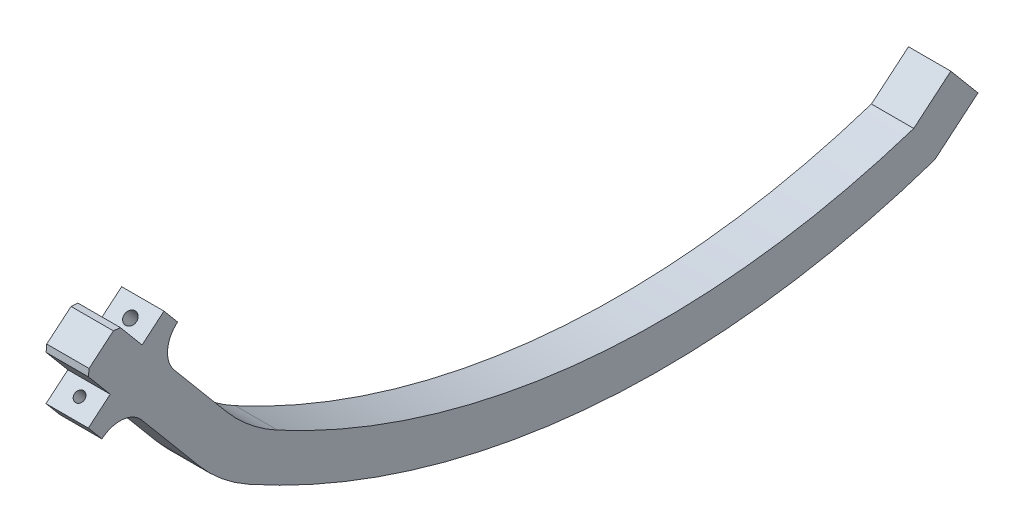
ISO-10303-21;
HEADER;
FILE_DESCRIPTION(('STEP AP214'),'2;1');
FILE_NAME('part.step','',(''),(''),'','','');
FILE_SCHEMA(('AUTOMOTIVE_DESIGN { 1 0 10303 214 1 1 1 1 }'));
ENDSEC;
DATA;
#1=APPLICATION_CONTEXT('core data for automotive mechanical design processes');
#2=APPLICATION_PROTOCOL_DEFINITION('international standard','automotive_design',2000,#1);
#3=PRODUCT_CONTEXT('',#1,'mechanical');
#4=PRODUCT('Part','Part','',(#3));
#5=PRODUCT_RELATED_PRODUCT_CATEGORY('part','',(#4));
#6=PRODUCT_DEFINITION_FORMATION('','',#4);
#7=PRODUCT_DEFINITION_CONTEXT('part definition',#1,'design');
#8=PRODUCT_DEFINITION('design','',#6,#7);
#9=PRODUCT_DEFINITION_SHAPE('','',#8);
#10=(LENGTH_UNIT() NAMED_UNIT(*) SI_UNIT(.MILLI.,.METRE.));
#11=(NAMED_UNIT(*) PLANE_ANGLE_UNIT() SI_UNIT($,.RADIAN.));
#12=(NAMED_UNIT(*) SI_UNIT($,.STERADIAN.) SOLID_ANGLE_UNIT());
#13=UNCERTAINTY_MEASURE_WITH_UNIT(LENGTH_MEASURE(1.E-05),#10,'distance_accuracy_value','');
#14=(GEOMETRIC_REPRESENTATION_CONTEXT(3) GLOBAL_UNCERTAINTY_ASSIGNED_CONTEXT((#13)) GLOBAL_UNIT_ASSIGNED_CONTEXT((#10,
#11,#12)) REPRESENTATION_CONTEXT('',''));
#15=CARTESIAN_POINT('',(0.,0.,0.));
#16=DIRECTION('',(0.,0.,1.));
#17=DIRECTION('',(1.,0.,0.));
#18=AXIS2_PLACEMENT_3D('',#15,#16,#17);
#19=CARTESIAN_POINT('',(12.,74.1271087713884,207.342601755654));
#20=DIRECTION('',(-1.,0.,0.));
#21=DIRECTION('',(0.,0.,1.));
#22=AXIS2_PLACEMENT_3D('',#19,#20,#21);
#23=CYLINDRICAL_SURFACE('',#22,8.00000000000002);
#24=CARTESIAN_POINT('',(0.,74.1271087713884,207.342601755654));
#25=DIRECTION('',(1.,0.,0.));
#26=DIRECTION('',(0.,0.,-1.));
#27=AXIS2_PLACEMENT_3D('',#24,#25,#26);
#28=CIRCLE('',#27,8.00000000000002);
#29=CARTESIAN_POINT('',(0.,80.2554643163402,212.484902633146));
#30=VERTEX_POINT('',#29);
#31=CARTESIAN_POINT('',(0.,68.9848078938961,213.470957300606));
#32=VERTEX_POINT('',#31);
#33=EDGE_CURVE('E194',#30,#32,#28,.T.);
#34=ORIENTED_EDGE('',*,*,#33,.F.);
#35=DIRECTION('',(-1.,0.,0.));
#36=VECTOR('',#35,1.);
#37=CARTESIAN_POINT('',(12.,80.2554643163402,212.484902633146));
#38=LINE('',#37,#36);
#39=CARTESIAN_POINT('',(12.,80.2554643163402,212.484902633146));
#40=VERTEX_POINT('',#39);
#41=EDGE_CURVE('E245',#40,#30,#38,.T.);
#42=ORIENTED_EDGE('',*,*,#41,.F.);
#43=CARTESIAN_POINT('',(12.,74.1271087713884,207.342601755654));
#44=DIRECTION('',(1.,0.,0.));
#45=DIRECTION('',(0.,0.,-1.));
#46=AXIS2_PLACEMENT_3D('',#43,#44,#45);
#47=CIRCLE('',#46,8.00000000000002);
#48=CARTESIAN_POINT('',(12.,68.9848078938961,213.470957300606));
#49=VERTEX_POINT('',#48);
#50=EDGE_CURVE('E233',#40,#49,#47,.T.);
#51=ORIENTED_EDGE('',*,*,#50,.T.);
#52=DIRECTION('',(-1.,0.,0.));
#53=VECTOR('',#52,1.);
#54=CARTESIAN_POINT('',(12.,68.9848078938961,213.470957300606));
#55=LINE('',#54,#53);
#56=EDGE_CURVE('E241',#49,#32,#55,.T.);
#57=ORIENTED_EDGE('',*,*,#56,.T.);
#58=EDGE_LOOP('',(#34,#42,#51,#57));
#59=FACE_BOUND('',#58,.T.);
#60=CARTESIAN_POINT('',(7.46354696492271,72.7379233500529,215.221063779751));
#61=CARTESIAN_POINT('',(7.50958148855328,72.7949489550504,215.231122511564));
#62=CARTESIAN_POINT('',(7.55431123800115,72.8530918477319,215.240732876881));
#63=CARTESIAN_POINT('',(7.64129948290581,72.9713409745247,215.258899053747));
#64=CARTESIAN_POINT('',(7.68355847351806,73.0314468114605,215.267455076977));
#65=CARTESIAN_POINT('',(7.76575888459811,73.1533692767686,215.283358338121));
#66=CARTESIAN_POINT('',(7.80570047439717,73.2151857796548,215.290705664427));
#67=CARTESIAN_POINT('',(7.88334496343659,73.3403491122129,215.304069722106));
#68=CARTESIAN_POINT('',(7.92104771447449,73.4036960428036,215.310086365465));
#69=CARTESIAN_POINT('',(8.03186693351505,73.5975475732911,215.326116981634));
#70=CARTESIAN_POINT('',(8.10158724359517,73.7302094640097,215.333890311335));
#71=CARTESIAN_POINT('',(8.23190456869935,74.0001583942434,215.342735322807));
#72=CARTESIAN_POINT('',(8.29250077741559,74.1374458412141,215.343806412631));
#73=CARTESIAN_POINT('',(8.40432850268299,74.416677847091,215.338586133065));
#74=CARTESIAN_POINT('',(8.45549875368406,74.5586462572177,215.332248437505));
#75=CARTESIAN_POINT('',(8.54699183390785,74.8455140384599,215.311577560258));
#76=CARTESIAN_POINT('',(8.58731348534083,74.9904137259782,215.297243510958));
#77=CARTESIAN_POINT('',(8.65553377664549,75.2812566816938,215.260259289782));
#78=CARTESIAN_POINT('',(8.6834996882634,75.4271897906444,215.237655406847));
#79=CARTESIAN_POINT('',(8.72564020470527,75.7194065540804,215.18394365346));
#80=CARTESIAN_POINT('',(8.73982493835189,75.8656898717773,215.152842050196));
#81=CARTESIAN_POINT('',(8.75395513480862,76.1892416522893,215.074422104802));
#82=CARTESIAN_POINT('',(8.75005949771982,76.3662108693341,215.0250387254));
#83=CARTESIAN_POINT('',(8.71530205925443,76.7140968241649,214.914962521356));
#84=CARTESIAN_POINT('',(8.68445023066477,76.8850157759933,214.85427388577));
#85=CARTESIAN_POINT('',(8.61571414363197,77.133403204539,214.756797137446));
#86=CARTESIAN_POINT('',(8.58887638446079,77.2152381964416,214.723054254985));
#87=CARTESIAN_POINT('',(8.52744279758176,77.3752519539021,214.654039858714));
#88=CARTESIAN_POINT('',(8.49285097255972,77.4534325807865,214.618769141131));
#89=CARTESIAN_POINT('',(8.41586189069508,77.6053448540179,214.547386157525));
#90=CARTESIAN_POINT('',(8.37347181495184,77.6790805112913,214.511274692219));
#91=CARTESIAN_POINT('',(8.28098484056662,77.8214466964627,214.438955851652));
#92=CARTESIAN_POINT('',(8.23089160226708,77.8900796261854,214.402748529928));
#93=CARTESIAN_POINT('',(8.11823909114113,78.0277311007013,214.327717025179));
#94=CARTESIAN_POINT('',(8.05495478322723,78.0961959995371,214.288961269613));
#95=CARTESIAN_POINT('',(7.92010890238927,78.2255938774786,214.213415491001));
#96=CARTESIAN_POINT('',(7.84854987454188,78.2865291606223,214.176624868597));
#97=CARTESIAN_POINT('',(7.77315894214442,78.3433636047374,214.141365994856));
#98=B_SPLINE_CURVE_WITH_KNOTS('',3,(#60,#61,#62,#63,#64,#65,#66,#67,#68,#69,#70,#71,#72,#73,#74,
#75,#76,#77,#78,#79,#80,#81,#82,#83,#84,#85,#86,#87,#88,#89,#90,#91,#92,#93,#94,#95,#96,#97),
.UNSPECIFIED.,.F.,.F.,(4,2,2,2,2,2,2,2,2,2,2,2,2,2,2,2,2,2,4),(0.,0.221885951803031,
0.443727282774338,0.665552383449442,0.887392151756312,1.33706062495993,1.78676881261483,
2.23930407505452,2.69188844765875,3.14197737552839,3.59173524842635,4.14092084812213,
4.68990335558945,4.96705220630397,5.24405831957735,5.52081061430763,5.79743180760208,
6.09968703637855,6.40184954578756),.UNSPECIFIED.);
#99=CARTESIAN_POINT('',(7.4635469649228,72.737923350053,215.221063779751));
#100=VERTEX_POINT('',#99);
#101=CARTESIAN_POINT('',(7.77315894214437,78.3433636047375,214.141365994856));
#102=VERTEX_POINT('',#101);
#103=EDGE_CURVE('E346',#100,#102,#98,.T.);
#104=ORIENTED_EDGE('',*,*,#103,.T.);
#105=DIRECTION('',(-1.,0.,0.));
#106=VECTOR('',#105,1.);
#107=CARTESIAN_POINT('',(12.,78.3433636047375,214.141365994856));
#108=LINE('',#107,#106);
#109=CARTESIAN_POINT('',(4.22684105785563,78.3433636047375,214.141365994856));
#110=VERTEX_POINT('',#109);
#111=EDGE_CURVE('E227',#102,#110,#108,.T.);
#112=ORIENTED_EDGE('',*,*,#111,.T.);
#113=CARTESIAN_POINT('',(4.22684105785559,78.3433636047374,214.141365994856));
#114=CARTESIAN_POINT('',(4.16867459148364,78.2994879589187,214.168578729294));
#115=CARTESIAN_POINT('',(4.11277396126892,78.2531878615175,214.19670059365));
#116=CARTESIAN_POINT('',(4.00583648196659,78.1560442762788,214.254247975018));
#117=CARTESIAN_POINT('',(3.95479807504497,78.1052022538384,214.283673070024));
#118=CARTESIAN_POINT('',(3.85810117687148,77.9994942486752,214.343193907461));
#119=CARTESIAN_POINT('',(3.81241912786715,77.9446477515177,214.373285963324));
#120=CARTESIAN_POINT('',(3.72638156448441,77.8311007418773,214.433764883307));
#121=CARTESIAN_POINT('',(3.68602622477214,77.772400103109,214.464151757058));
#122=CARTESIAN_POINT('',(3.57323579405075,77.5911648430695,214.554984645678));
#123=CARTESIAN_POINT('',(3.50892543331302,77.4633308446304,214.615198160394));
#124=CARTESIAN_POINT('',(3.40221110982432,77.1971460619567,214.731514176474));
#125=CARTESIAN_POINT('',(3.35982377382767,77.0587873865997,214.787613530005));
#126=CARTESIAN_POINT('',(3.29386248450905,76.7663235903946,214.896430928469));
#127=CARTESIAN_POINT('',(3.27159506113856,76.6117728255835,214.948733460313));
#128=CARTESIAN_POINT('',(3.24821838550937,76.2983159743403,215.044078057078));
#129=CARTESIAN_POINT('',(3.24711820350719,76.1394080500521,215.087116144334));
#130=CARTESIAN_POINT('',(3.26132058748157,75.8628017254614,215.152972030641));
#131=CARTESIAN_POINT('',(3.27233296511735,75.7453987243075,215.178122390013));
#132=CARTESIAN_POINT('',(3.30338124234523,75.5107289852771,215.222950023977));
#133=CARTESIAN_POINT('',(3.32342051999276,75.3934623149041,215.242625245195));
#134=CARTESIAN_POINT('',(3.39584933525798,75.0424038287906,215.29358171257));
#135=CARTESIAN_POINT('',(3.46051851778779,74.8098290091888,215.316682103549));
#136=CARTESIAN_POINT('',(3.58774016643512,74.4378124300205,215.337870783037));
#137=CARTESIAN_POINT('',(3.64221601881,74.295762307957,215.342052245629));
#138=CARTESIAN_POINT('',(3.76099269325124,74.0156748965883,215.343048948672));
#139=CARTESIAN_POINT('',(3.82529842572279,73.8776396541194,215.339860496262));
#140=CARTESIAN_POINT('',(3.96302843241761,73.6069943775078,215.326824211775));
#141=CARTESIAN_POINT('',(4.03642935682221,73.4743715670909,215.31699315523));
#142=CARTESIAN_POINT('',(4.19248248537371,73.2153586213183,215.29153850667));
#143=CARTESIAN_POINT('',(4.27512671647115,73.0889632478611,215.275919880374));
#144=CARTESIAN_POINT('',(4.39068100152986,72.927564075143,215.252257430339));
#145=CARTESIAN_POINT('',(4.41909584967436,72.8889874376872,215.246306543818));
#146=CARTESIAN_POINT('',(4.47697047247836,72.8127556252071,215.233987155079));
#147=CARTESIAN_POINT('',(4.50642919044074,72.775099580066,215.227619069938));
#148=CARTESIAN_POINT('',(4.53645303507725,72.7379233500529,215.221063779751));
#149=B_SPLINE_CURVE_WITH_KNOTS('',3,(#113,#114,#115,#116,#117,#118,#119,#120,#121,#122,#123,
#124,#125,#126,#127,#128,#129,#130,#131,#132,#133,#134,#135,#136,#137,#138,#139,#140,#141,#142,
#143,#144,#145,#146,#147,#148),.UNSPECIFIED.,.F.,.F.,(4,2,2,2,2,2,2,2,2,2,2,2,2,2,2,2,2,4),(0.,
0.23323628560383,0.466397590263524,0.698491569527056,0.930593157408039,1.39407446711088,
1.85790677451497,2.3500558701375,2.84241584912891,3.2036554871883,3.56503042115028,
4.28923053457336,4.74537232050212,5.20174271604674,5.65696485970891,6.1117973249391,
6.25662116386555,6.40130236765936),.UNSPECIFIED.);
#150=CARTESIAN_POINT('',(4.5364530350772,72.737923350053,215.221063779751));
#151=VERTEX_POINT('',#150);
#152=EDGE_CURVE('E355',#110,#151,#149,.T.);
#153=ORIENTED_EDGE('',*,*,#152,.T.);
#154=DIRECTION('',(-1.,0.,0.));
#155=VECTOR('',#154,1.);
#156=CARTESIAN_POINT('',(12.,72.737923350053,215.221063779751));
#157=LINE('',#156,#155);
#158=EDGE_CURVE('E342',#100,#151,#157,.T.);
#159=ORIENTED_EDGE('',*,*,#158,.F.);
#160=EDGE_LOOP('',(#104,#112,#153,#159));
#161=FACE_BOUND('',#160,.T.);
#162=ADVANCED_FACE('F34',(#59,#161),#23,.F.);
#163=CARTESIAN_POINT('',(6.,74.2344635393063,213.437556632747));
#164=DIRECTION('',(0.,0.766044443118983,0.642787609686534));
#165=DIRECTION('',(0.,-0.642787609686534,0.766044443118983));
#166=AXIS2_PLACEMENT_3D('',#163,#164,#165);
#167=CYLINDRICAL_SURFACE('',#166,1.74999999999999);
#168=CARTESIAN_POINT('',(6.,81.8949079704961,219.865432729613));
#169=DIRECTION('',(0.,0.766044443118983,0.642787609686534));
#170=DIRECTION('',(0.,-0.642787609686534,0.766044443118983));
#171=AXIS2_PLACEMENT_3D('',#168,#169,#170);
#172=CIRCLE('',#171,1.74999999999999);
#173=CARTESIAN_POINT('',(6.,80.7700296535447,221.206010505071));
#174=VERTEX_POINT('',#173);
#175=EDGE_CURVE('E230',#174,#174,#172,.T.);
#176=ORIENTED_EDGE('',*,*,#175,.T.);
#177=EDGE_LOOP('',(#176));
#178=FACE_BOUND('',#177,.T.);
#179=CARTESIAN_POINT('',(6.,76.9922235345346,215.751592027619));
#180=DIRECTION('',(0.,-0.766044443118983,-0.642787609686534));
#181=DIRECTION('',(0.,0.642787609686534,-0.766044443118983));
#182=AXIS2_PLACEMENT_3D('',#179,#180,#181);
#183=CIRCLE('',#182,1.74999999999999);
#184=CARTESIAN_POINT('',(6.,78.117101851486,214.41101425216));
#185=VERTEX_POINT('',#184);
#186=EDGE_CURVE('E225',#185,#185,#183,.F.);
#187=ORIENTED_EDGE('',*,*,#186,.F.);
#188=EDGE_LOOP('',(#187));
#189=FACE_BOUND('',#188,.T.);
#190=ADVANCED_FACE('F373',(#178,#189),#167,.F.);
#191=CARTESIAN_POINT('',(-52.3125128274926,79.7094300975618,222.469983836217));
#192=DIRECTION('',(0.,0.642787609686534,-0.766044443118982));
#193=DIRECTION('',(0.,0.766044443118982,0.642787609686534));
#194=AXIS2_PLACEMENT_3D('',#191,#192,#193);
#195=PLANE('',#194);
#196=DIRECTION('',(0.,0.766044443118982,0.642787609686534));
#197=VECTOR('',#196,1.);
#198=CARTESIAN_POINT('',(0.,79.7094300975618,222.469983836217));
#199=LINE('',#198,#197);
#200=CARTESIAN_POINT('',(0.,51.3867992041198,198.70447469956));
#201=VERTEX_POINT('',#200);
#202=EDGE_CURVE('E284',#201,#32,#199,.T.);
#203=ORIENTED_EDGE('',*,*,#202,.T.);
#204=ORIENTED_EDGE('',*,*,#56,.F.);
#205=DIRECTION('',(0.,0.766044443118982,0.642787609686534));
#206=VECTOR('',#205,1.);
#207=CARTESIAN_POINT('',(12.,79.7094300975618,222.469983836217));
#208=LINE('',#207,#206);
#209=CARTESIAN_POINT('',(12.,51.3867992041199,198.70447469956));
#210=VERTEX_POINT('',#209);
#211=EDGE_CURVE('E281',#210,#49,#208,.T.);
#212=ORIENTED_EDGE('',*,*,#211,.F.);
#213=DIRECTION('',(-1.,0.,0.));
#214=VECTOR('',#213,1.);
#215=CARTESIAN_POINT('',(-52.3125128274926,51.3867992041198,198.70447469956));
#216=LINE('',#215,#214);
#217=EDGE_CURVE('E336',#210,#201,#216,.T.);
#218=ORIENTED_EDGE('',*,*,#217,.T.);
#219=EDGE_LOOP('',(#203,#204,#212,#218));
#220=FACE_BOUND('',#219,.T.);
#221=ADVANCED_FACE('F377',(#220),#195,.T.);
#222=CARTESIAN_POINT('',(0.,71.9959787813234,231.662517153645));
#223=DIRECTION('',(0.,0.642787609686535,-0.766044443118982));
#224=DIRECTION('',(0.,0.766044443118982,0.642787609686535));
#225=AXIS2_PLACEMENT_3D('',#222,#223,#224);
#226=PLANE('',#225);
#227=DIRECTION('',(-1.,0.,0.));
#228=VECTOR('',#227,1.);
#229=CARTESIAN_POINT('',(12.,61.2713565776577,222.663490618033));
#230=LINE('',#229,#228);
#231=CARTESIAN_POINT('',(12.,61.2713565776577,222.663490618033));
#232=VERTEX_POINT('',#231);
#233=CARTESIAN_POINT('',(0.,61.2713565776577,222.663490618033));
#234=VERTEX_POINT('',#233);
#235=EDGE_CURVE('E260',#232,#234,#230,.T.);
#236=ORIENTED_EDGE('',*,*,#235,.T.);
#237=DIRECTION('',(0.,-0.766044443118982,-0.642787609686535));
#238=VECTOR('',#237,1.);
#239=CARTESIAN_POINT('',(0.,94.3966616452473,250.458921882882));
#240=LINE('',#239,#238);
#241=CARTESIAN_POINT('',(0.,41.9450844088605,206.446822769164));
#242=VERTEX_POINT('',#241);
#243=EDGE_CURVE('E321',#234,#242,#240,.T.);
#244=ORIENTED_EDGE('',*,*,#243,.T.);
#245=DIRECTION('',(-1.,0.,0.));
#246=VECTOR('',#245,1.);
#247=CARTESIAN_POINT('',(0.,41.9450844088605,206.446822769164));
#248=LINE('',#247,#246);
#249=CARTESIAN_POINT('',(12.,41.9450844088605,206.446822769164));
#250=VERTEX_POINT('',#249);
#251=EDGE_CURVE('E329',#242,#250,#248,.F.);
#252=ORIENTED_EDGE('',*,*,#251,.T.);
#253=DIRECTION('',(0.,0.766044443118982,0.642787609686535));
#254=VECTOR('',#253,1.);
#255=CARTESIAN_POINT('',(12.,71.9959787813234,231.662517153645));
#256=LINE('',#255,#254);
#257=EDGE_CURVE('E279',#250,#232,#256,.T.);
#258=ORIENTED_EDGE('',*,*,#257,.T.);
#259=EDGE_LOOP('',(#236,#244,#252,#258));
#260=FACE_BOUND('',#259,.T.);
#261=ADVANCED_FACE('F436',(#260),#226,.F.);
#262=CARTESIAN_POINT('',(12.,241.476472406345,75.1760290102655));
#263=DIRECTION('',(-1.,0.,0.));
#264=DIRECTION('',(0.,0.,1.));
#265=AXIS2_PLACEMENT_3D('',#262,#263,#264);
#266=CYLINDRICAL_SURFACE('',#265,241.476472406345);
#267=CARTESIAN_POINT('',(12.,241.476472406345,75.1760290102655));
#268=DIRECTION('',(1.,0.,0.));
#269=DIRECTION('',(0.,0.,1.));
#270=AXIS2_PLACEMENT_3D('',#267,#268,#269);
#271=CIRCLE('',#270,241.476472406345);
#272=CARTESIAN_POINT('',(12.,30.3736096091177,192.421361730282));
#273=VERTEX_POINT('',#272);
#274=CARTESIAN_POINT('',(12.,12.7411493725965,-2.22577150147341));
#275=VERTEX_POINT('',#274);
#276=EDGE_CURVE('E310',#273,#275,#271,.T.);
#277=ORIENTED_EDGE('',*,*,#276,.F.);
#278=DIRECTION('',(-1.,0.,0.));
#279=VECTOR('',#278,1.);
#280=CARTESIAN_POINT('',(12.,30.3736096091177,192.421361730282));
#281=LINE('',#280,#279);
#282=CARTESIAN_POINT('',(0.,30.3736096091177,192.421361730282));
#283=VERTEX_POINT('',#282);
#284=EDGE_CURVE('E323',#273,#283,#281,.T.);
#285=ORIENTED_EDGE('',*,*,#284,.T.);
#286=CARTESIAN_POINT('',(0.,241.476472406345,75.1760290102655));
#287=DIRECTION('',(1.,0.,0.));
#288=DIRECTION('',(0.,0.,1.));
#289=AXIS2_PLACEMENT_3D('',#286,#287,#288);
#290=CIRCLE('',#289,241.476472406345);
#291=CARTESIAN_POINT('',(0.,12.7411493725965,-2.22577150147341));
#292=VERTEX_POINT('',#291);
#293=EDGE_CURVE('E309',#283,#292,#290,.T.);
#294=ORIENTED_EDGE('',*,*,#293,.T.);
#295=DIRECTION('',(-1.,0.,0.));
#296=VECTOR('',#295,1.);
#297=CARTESIAN_POINT('',(12.,12.7411493725965,-2.22577150147341));
#298=LINE('',#297,#296);
#299=EDGE_CURVE('E306',#275,#292,#298,.T.);
#300=ORIENTED_EDGE('',*,*,#299,.F.);
#301=EDGE_LOOP('',(#277,#285,#294,#300));
#302=FACE_BOUND('',#301,.T.);
#303=ADVANCED_FACE('F445',(#302),#266,.T.);
#304=CARTESIAN_POINT('',(12.,241.476472406345,75.1760290102655));
#305=DIRECTION('',(-1.,0.,0.));
#306=DIRECTION('',(0.,0.,1.));
#307=AXIS2_PLACEMENT_3D('',#304,#305,#306);
#308=CYLINDRICAL_SURFACE('',#307,229.476472406345);
#309=CARTESIAN_POINT('',(0.,241.476472406345,75.1760290102655));
#310=DIRECTION('',(-1.,0.,0.));
#311=DIRECTION('',(0.,0.,1.));
#312=AXIS2_PLACEMENT_3D('',#309,#310,#311);
#313=CIRCLE('',#312,229.476472406345);
#314=CARTESIAN_POINT('',(0.,23.403668611832,3.73581881138778));
#315=VERTEX_POINT('',#314);
#316=CARTESIAN_POINT('',(0.,39.5231160556017,184.145259744128));
#317=VERTEX_POINT('',#316);
#318=EDGE_CURVE('E313',#315,#317,#313,.T.);
#319=ORIENTED_EDGE('',*,*,#318,.T.);
#320=DIRECTION('',(-1.,0.,0.));
#321=VECTOR('',#320,1.);
#322=CARTESIAN_POINT('',(12.,39.5231160556017,184.145259744128));
#323=LINE('',#322,#321);
#324=CARTESIAN_POINT('',(12.,39.5231160556017,184.145259744128));
#325=VERTEX_POINT('',#324);
#326=EDGE_CURVE('E333',#317,#325,#323,.F.);
#327=ORIENTED_EDGE('',*,*,#326,.T.);
#328=CARTESIAN_POINT('',(12.,241.476472406345,75.1760290102655));
#329=DIRECTION('',(-1.,0.,0.));
#330=DIRECTION('',(0.,0.,1.));
#331=AXIS2_PLACEMENT_3D('',#328,#329,#330);
#332=CIRCLE('',#331,229.476472406345);
#333=CARTESIAN_POINT('',(12.,23.403668611832,3.73581881138778));
#334=VERTEX_POINT('',#333);
#335=EDGE_CURVE('E312',#334,#325,#332,.T.);
#336=ORIENTED_EDGE('',*,*,#335,.F.);
#337=DIRECTION('',(-1.,0.,0.));
#338=VECTOR('',#337,1.);
#339=CARTESIAN_POINT('',(12.,23.403668611832,3.73581881138778));
#340=LINE('',#339,#338);
#341=EDGE_CURVE('E316',#334,#315,#340,.T.);
#342=ORIENTED_EDGE('',*,*,#341,.T.);
#343=EDGE_LOOP('',(#319,#327,#336,#342));
#344=FACE_BOUND('',#343,.T.);
#345=ADVANCED_FACE('F464',(#344),#308,.F.);
#346=CARTESIAN_POINT('',(12.,241.476472406345,75.1760290102655));
#347=DIRECTION('',(-1.,0.,0.));
#348=DIRECTION('',(0.,0.,1.));
#349=AXIS2_PLACEMENT_3D('',#346,#347,#348);
#350=PLANE('',#349);
#351=DIRECTION('',(0.,0.642787609686534,-0.766044443118982));
#352=VECTOR('',#351,1.);
#353=CARTESIAN_POINT('',(12.,79.7094300975618,222.469983836217));
#354=LINE('',#353,#352);
#355=CARTESIAN_POINT('',(12.,79.6451513365932,222.546588280529));
#356=VERTEX_POINT('',#355);
#357=CARTESIAN_POINT('',(12.,84.8517309750541,216.341628291265));
#358=VERTEX_POINT('',#357);
#359=EDGE_CURVE('E236',#356,#358,#354,.T.);
#360=ORIENTED_EDGE('',*,*,#359,.F.);
#361=DIRECTION('',(0.,-0.766044443118979,-0.642787609686538));
#362=VECTOR('',#361,1.);
#363=CARTESIAN_POINT('',(12.,79.6451513365932,222.546588280529));
#364=LINE('',#363,#362);
#365=CARTESIAN_POINT('',(12.,86.9991779905354,228.71734933352));
#366=VERTEX_POINT('',#365);
#367=EDGE_CURVE('E198',#366,#356,#364,.T.);
#368=ORIENTED_EDGE('',*,*,#367,.F.);
#369=DIRECTION('',(0.,0.0871557427476679,0.996194698091745));
#370=VECTOR('',#369,1.);
#371=CARTESIAN_POINT('',(12.,87.1717375573408,230.689714207447));
#372=LINE('',#371,#370);
#373=CARTESIAN_POINT('',(12.,87.1717375573408,230.689714207447));
#374=VERTEX_POINT('',#373);
#375=EDGE_CURVE('E11',#366,#374,#372,.T.);
#376=ORIENTED_EDGE('',*,*,#375,.T.);
#377=DIRECTION('',(0.,0.642787609686532,-0.766044443118984));
#378=VECTOR('',#377,1.);
#379=CARTESIAN_POINT('',(12.,80.4224676556322,238.733180860197));
#380=LINE('',#379,#378);
#381=CARTESIAN_POINT('',(12.,81.3866490701621,237.584114195518));
#382=VERTEX_POINT('',#381);
#383=EDGE_CURVE('E269',#382,#374,#380,.T.);
#384=ORIENTED_EDGE('',*,*,#383,.F.);
#385=DIRECTION('',(0.,0.996194698091746,-0.0871557427476487));
#386=VECTOR('',#385,1.);
#387=CARTESIAN_POINT('',(12.,81.3866490701621,237.584114195518));
#388=LINE('',#387,#386);
#389=CARTESIAN_POINT('',(12.,79.4142841962344,237.756673762324));
#390=VERTEX_POINT('',#389);
#391=EDGE_CURVE('E42',#382,#390,#388,.F.);
#392=ORIENTED_EDGE('',*,*,#391,.T.);
#393=DIRECTION('',(0.,0.766044443118984,0.642787609686532));
#394=VECTOR('',#393,1.);
#395=CARTESIAN_POINT('',(12.,72.0602575422921,231.585912709333));
#396=LINE('',#395,#394);
#397=CARTESIAN_POINT('',(12.,72.0602575422921,231.585912709333));
#398=VERTEX_POINT('',#397);
#399=EDGE_CURVE('E57',#398,#390,#396,.T.);
#400=ORIENTED_EDGE('',*,*,#399,.F.);
#401=DIRECTION('',(0.,0.642787609686534,-0.766044443118982));
#402=VECTOR('',#401,1.);
#403=CARTESIAN_POINT('',(12.,71.9959787813234,231.662517153645));
#404=LINE('',#403,#402);
#405=CARTESIAN_POINT('',(12.,66.8536779038312,237.790872698597));
#406=VERTEX_POINT('',#405);
#407=EDGE_CURVE('E258',#406,#398,#404,.T.);
#408=ORIENTED_EDGE('',*,*,#407,.F.);
#409=DIRECTION('',(0.,0.766044443118984,0.642787609686532));
#410=VECTOR('',#409,1.);
#411=CARTESIAN_POINT('',(12.,66.8536779038312,237.790872698597));
#412=LINE('',#411,#410);
#413=CARTESIAN_POINT('',(12.,62.2574112451172,233.934147040477));
#414=VERTEX_POINT('',#413);
#415=EDGE_CURVE('E254',#414,#406,#412,.T.);
#416=ORIENTED_EDGE('',*,*,#415,.F.);
#417=CARTESIAN_POINT('',(12.,56.1290557001654,228.791846162985));
#418=DIRECTION('',(1.,0.,0.));
#419=DIRECTION('',(0.,0.,1.));
#420=AXIS2_PLACEMENT_3D('',#417,#418,#419);
#421=CIRCLE('',#420,8.);
#422=EDGE_CURVE('E251',#232,#414,#421,.T.);
#423=ORIENTED_EDGE('',*,*,#422,.F.);
#424=ORIENTED_EDGE('',*,*,#257,.F.);
#425=CARTESIAN_POINT('',(12.,74.0844648931873,168.144600613215));
#426=DIRECTION('',(-1.,0.,0.));
#427=DIRECTION('',(0.,0.,1.));
#428=AXIS2_PLACEMENT_3D('',#425,#426,#427);
#429=CIRCLE('',#428,50.);
#430=EDGE_CURVE('E331',#250,#273,#429,.F.);
#431=ORIENTED_EDGE('',*,*,#430,.T.);
#432=ORIENTED_EDGE('',*,*,#276,.T.);
#433=DIRECTION('',(0.,0.642787609686534,-0.766044443118982));
#434=VECTOR('',#433,1.);
#435=CARTESIAN_POINT('',(12.,23.0257511275811,-14.4824825913771));
#436=LINE('',#435,#434);
#437=CARTESIAN_POINT('',(12.,23.0257511275811,-14.4824825913771));
#438=VERTEX_POINT('',#437);
#439=EDGE_CURVE('E287',#275,#438,#436,.T.);
#440=ORIENTED_EDGE('',*,*,#439,.T.);
#441=DIRECTION('',(0.,0.766044443118981,0.642787609686535));
#442=VECTOR('',#441,1.);
#443=CARTESIAN_POINT('',(12.,32.2182844450088,-6.7690312751387));
#444=LINE('',#443,#442);
#445=CARTESIAN_POINT('',(12.,32.2182844450088,-6.7690312751387));
#446=VERTEX_POINT('',#445);
#447=EDGE_CURVE('E289',#438,#446,#444,.T.);
#448=ORIENTED_EDGE('',*,*,#447,.T.);
#449=DIRECTION('',(0.,-0.642787609686535,0.766044443118982));
#450=VECTOR('',#449,1.);
#451=CARTESIAN_POINT('',(12.,23.403668611832,3.73581881138778));
#452=LINE('',#451,#450);
#453=EDGE_CURVE('E292',#446,#334,#452,.T.);
#454=ORIENTED_EDGE('',*,*,#453,.T.);
#455=ORIENTED_EDGE('',*,*,#335,.T.);
#456=CARTESIAN_POINT('',(12.,83.5261796884465,160.402252543611));
#457=DIRECTION('',(-1.,0.,0.));
#458=DIRECTION('',(0.,0.,1.));
#459=AXIS2_PLACEMENT_3D('',#456,#457,#458);
#460=CIRCLE('',#459,50.);
#461=EDGE_CURVE('E338',#325,#210,#460,.T.);
#462=ORIENTED_EDGE('',*,*,#461,.T.);
#463=ORIENTED_EDGE('',*,*,#211,.T.);
#464=ORIENTED_EDGE('',*,*,#50,.F.);
#465=DIRECTION('',(0.,-0.766044443118978,-0.642787609686539));
#466=VECTOR('',#465,1.);
#467=CARTESIAN_POINT('',(12.,84.8517309750541,216.341628291265));
#468=LINE('',#467,#466);
#469=EDGE_CURVE('E238',#358,#40,#468,.T.);
#470=ORIENTED_EDGE('',*,*,#469,.F.);
#471=EDGE_LOOP('',(#360,#368,#376,#384,#392,#400,#408,#416,#423,#424,#431,#432,#440,#448,#454,
#455,#462,#463,#464,#470));
#472=FACE_BOUND('',#471,.T.);
#473=ADVANCED_FACE('F417',(#472),#350,.F.);
#474=CARTESIAN_POINT('',(0.,241.476472406345,75.1760290102655));
#475=DIRECTION('',(-1.,0.,0.));
#476=DIRECTION('',(0.,0.,1.));
#477=AXIS2_PLACEMENT_3D('',#474,#475,#476);
#478=PLANE('',#477);
#479=DIRECTION('',(0.,-0.766044443118979,-0.642787609686538));
#480=VECTOR('',#479,1.);
#481=CARTESIAN_POINT('',(0.,79.6451513365932,222.546588280529));
#482=LINE('',#481,#480);
#483=CARTESIAN_POINT('',(0.,86.9991779905354,228.71734933352));
#484=VERTEX_POINT('',#483);
#485=CARTESIAN_POINT('',(0.,79.6451513365932,222.546588280529));
#486=VERTEX_POINT('',#485);
#487=EDGE_CURVE('E49',#484,#486,#482,.T.);
#488=ORIENTED_EDGE('',*,*,#487,.T.);
#489=DIRECTION('',(0.,0.642787609686534,-0.766044443118982));
#490=VECTOR('',#489,1.);
#491=CARTESIAN_POINT('',(0.,79.7094300975618,222.469983836217));
#492=LINE('',#491,#490);
#493=CARTESIAN_POINT('',(0.,84.8517309750541,216.341628291265));
#494=VERTEX_POINT('',#493);
#495=EDGE_CURVE('E184',#486,#494,#492,.T.);
#496=ORIENTED_EDGE('',*,*,#495,.T.);
#497=DIRECTION('',(0.,-0.766044443118978,-0.642787609686539));
#498=VECTOR('',#497,1.);
#499=CARTESIAN_POINT('',(0.,84.8517309750541,216.341628291265));
#500=LINE('',#499,#498);
#501=EDGE_CURVE('E193',#494,#30,#500,.T.);
#502=ORIENTED_EDGE('',*,*,#501,.T.);
#503=ORIENTED_EDGE('',*,*,#33,.T.);
#504=ORIENTED_EDGE('',*,*,#202,.F.);
#505=CARTESIAN_POINT('',(0.,83.5261796884465,160.402252543611));
#506=DIRECTION('',(-1.,0.,0.));
#507=DIRECTION('',(0.,0.,1.));
#508=AXIS2_PLACEMENT_3D('',#505,#506,#507);
#509=CIRCLE('',#508,50.);
#510=EDGE_CURVE('E340',#201,#317,#509,.F.);
#511=ORIENTED_EDGE('',*,*,#510,.T.);
#512=ORIENTED_EDGE('',*,*,#318,.F.);
#513=DIRECTION('',(0.,-0.642787609686535,0.766044443118982));
#514=VECTOR('',#513,1.);
#515=CARTESIAN_POINT('',(0.,23.403668611832,3.73581881138778));
#516=LINE('',#515,#514);
#517=CARTESIAN_POINT('',(0.,32.2182844450088,-6.7690312751387));
#518=VERTEX_POINT('',#517);
#519=EDGE_CURVE('E290',#518,#315,#516,.T.);
#520=ORIENTED_EDGE('',*,*,#519,.F.);
#521=DIRECTION('',(0.,0.766044443118981,0.642787609686535));
#522=VECTOR('',#521,1.);
#523=CARTESIAN_POINT('',(0.,32.2182844450088,-6.7690312751387));
#524=LINE('',#523,#522);
#525=CARTESIAN_POINT('',(0.,23.0257511275811,-14.4824825913771));
#526=VERTEX_POINT('',#525);
#527=EDGE_CURVE('E297',#526,#518,#524,.T.);
#528=ORIENTED_EDGE('',*,*,#527,.F.);
#529=DIRECTION('',(0.,0.642787609686534,-0.766044443118982));
#530=VECTOR('',#529,1.);
#531=CARTESIAN_POINT('',(0.,23.0257511275811,-14.4824825913771));
#532=LINE('',#531,#530);
#533=EDGE_CURVE('E286',#292,#526,#532,.T.);
#534=ORIENTED_EDGE('',*,*,#533,.F.);
#535=ORIENTED_EDGE('',*,*,#293,.F.);
#536=CARTESIAN_POINT('',(0.,74.0844648931873,168.144600613215));
#537=DIRECTION('',(-1.,0.,0.));
#538=DIRECTION('',(0.,0.,1.));
#539=AXIS2_PLACEMENT_3D('',#536,#537,#538);
#540=CIRCLE('',#539,50.);
#541=EDGE_CURVE('E326',#283,#242,#540,.T.);
#542=ORIENTED_EDGE('',*,*,#541,.T.);
#543=ORIENTED_EDGE('',*,*,#243,.F.);
#544=CARTESIAN_POINT('',(0.,56.1290557001654,228.791846162985));
#545=DIRECTION('',(1.,0.,0.));
#546=DIRECTION('',(0.,0.,1.));
#547=AXIS2_PLACEMENT_3D('',#544,#545,#546);
#548=CIRCLE('',#547,8.);
#549=CARTESIAN_POINT('',(0.,62.2574112451172,233.934147040477));
#550=VERTEX_POINT('',#549);
#551=EDGE_CURVE('E247',#234,#550,#548,.T.);
#552=ORIENTED_EDGE('',*,*,#551,.T.);
#553=DIRECTION('',(0.,0.766044443118984,0.642787609686532));
#554=VECTOR('',#553,1.);
#555=CARTESIAN_POINT('',(0.,66.8536779038312,237.790872698597));
#556=LINE('',#555,#554);
#557=CARTESIAN_POINT('',(0.,66.8536779038312,237.790872698597));
#558=VERTEX_POINT('',#557);
#559=EDGE_CURVE('E263',#550,#558,#556,.T.);
#560=ORIENTED_EDGE('',*,*,#559,.T.);
#561=DIRECTION('',(0.,0.642787609686534,-0.766044443118982));
#562=VECTOR('',#561,1.);
#563=CARTESIAN_POINT('',(0.,71.9959787813234,231.662517153645));
#564=LINE('',#563,#562);
#565=CARTESIAN_POINT('',(0.,72.0602575422921,231.585912709333));
#566=VERTEX_POINT('',#565);
#567=EDGE_CURVE('E255',#558,#566,#564,.T.);
#568=ORIENTED_EDGE('',*,*,#567,.T.);
#569=DIRECTION('',(0.,0.766044443118984,0.642787609686532));
#570=VECTOR('',#569,1.);
#571=CARTESIAN_POINT('',(0.,72.0602575422921,231.585912709333));
#572=LINE('',#571,#570);
#573=CARTESIAN_POINT('',(0.,79.4142841962344,237.756673762324));
#574=VERTEX_POINT('',#573);
#575=EDGE_CURVE('E214',#566,#574,#572,.T.);
#576=ORIENTED_EDGE('',*,*,#575,.T.);
#577=DIRECTION('',(0.,-0.996194698091746,0.0871557427476487));
#578=VECTOR('',#577,1.);
#579=CARTESIAN_POINT('',(0.,254.361344353563,222.450789281371));
#580=LINE('',#579,#578);
#581=CARTESIAN_POINT('',(0.,81.3866490701621,237.584114195518));
#582=VERTEX_POINT('',#581);
#583=EDGE_CURVE('E411',#574,#582,#580,.F.);
#584=ORIENTED_EDGE('',*,*,#583,.T.);
#585=DIRECTION('',(0.,-0.642787609686532,0.766044443118984));
#586=VECTOR('',#585,1.);
#587=CARTESIAN_POINT('',(0.,80.4224676556322,238.733180860197));
#588=LINE('',#587,#586);
#589=CARTESIAN_POINT('',(0.,87.1717375573408,230.689714207447));
#590=VERTEX_POINT('',#589);
#591=EDGE_CURVE('E276',#590,#582,#588,.T.);
#592=ORIENTED_EDGE('',*,*,#591,.F.);
#593=DIRECTION('',(0.,-0.0871557427476679,-0.996194698091745));
#594=VECTOR('',#593,1.);
#595=CARTESIAN_POINT('',(0.,74.8415213605659,89.7546981739701));
#596=LINE('',#595,#594);
#597=EDGE_CURVE('E205',#590,#484,#596,.T.);
#598=ORIENTED_EDGE('',*,*,#597,.T.);
#599=EDGE_LOOP('',(#488,#496,#502,#503,#504,#511,#512,#520,#528,#534,#535,#542,#543,#552,#560,
#568,#576,#584,#592,#598));
#600=FACE_BOUND('',#599,.T.);
#601=ADVANCED_FACE('F203',(#600),#478,.T.);
#602=CARTESIAN_POINT('',(12.,23.0257511275811,-14.4824825913771));
#603=DIRECTION('',(0.,0.766044443118982,0.642787609686534));
#604=DIRECTION('',(0.,-0.642787609686534,0.766044443118982));
#605=AXIS2_PLACEMENT_3D('',#602,#603,#604);
#606=PLANE('',#605);
#607=ORIENTED_EDGE('',*,*,#533,.T.);
#608=DIRECTION('',(-1.,0.,0.));
#609=VECTOR('',#608,1.);
#610=CARTESIAN_POINT('',(12.,23.0257511275811,-14.4824825913771));
#611=LINE('',#610,#609);
#612=EDGE_CURVE('E303',#438,#526,#611,.T.);
#613=ORIENTED_EDGE('',*,*,#612,.F.);
#614=ORIENTED_EDGE('',*,*,#439,.F.);
#615=ORIENTED_EDGE('',*,*,#299,.T.);
#616=EDGE_LOOP('',(#607,#613,#614,#615));
#617=FACE_BOUND('',#616,.T.);
#618=ADVANCED_FACE('F452',(#617),#606,.F.);
#619=CARTESIAN_POINT('',(12.,32.2182844450088,-6.7690312751387));
#620=DIRECTION('',(0.,-0.642787609686535,0.766044443118981));
#621=DIRECTION('',(0.,-0.766044443118981,-0.642787609686535));
#622=AXIS2_PLACEMENT_3D('',#619,#620,#621);
#623=PLANE('',#622);
#624=ORIENTED_EDGE('',*,*,#527,.T.);
#625=DIRECTION('',(-1.,0.,0.));
#626=VECTOR('',#625,1.);
#627=CARTESIAN_POINT('',(12.,32.2182844450088,-6.7690312751387));
#628=LINE('',#627,#626);
#629=EDGE_CURVE('E295',#446,#518,#628,.T.);
#630=ORIENTED_EDGE('',*,*,#629,.F.);
#631=ORIENTED_EDGE('',*,*,#447,.F.);
#632=ORIENTED_EDGE('',*,*,#612,.T.);
#633=EDGE_LOOP('',(#624,#630,#631,#632));
#634=FACE_BOUND('',#633,.T.);
#635=ADVANCED_FACE('F456',(#634),#623,.F.);
#636=CARTESIAN_POINT('',(12.,23.403668611832,3.73581881138778));
#637=DIRECTION('',(0.,-0.766044443118981,-0.642787609686535));
#638=DIRECTION('',(0.,0.642787609686535,-0.766044443118982));
#639=AXIS2_PLACEMENT_3D('',#636,#637,#638);
#640=PLANE('',#639);
#641=ORIENTED_EDGE('',*,*,#519,.T.);
#642=ORIENTED_EDGE('',*,*,#341,.F.);
#643=ORIENTED_EDGE('',*,*,#453,.F.);
#644=ORIENTED_EDGE('',*,*,#629,.T.);
#645=EDGE_LOOP('',(#641,#642,#643,#644));
#646=FACE_BOUND('',#645,.T.);
#647=ADVANCED_FACE('F461',(#646),#640,.F.);
#648=CARTESIAN_POINT('',(12.,74.0844648931873,168.144600613215));
#649=DIRECTION('',(-1.,0.,0.));
#650=DIRECTION('',(0.,0.,1.));
#651=AXIS2_PLACEMENT_3D('',#648,#649,#650);
#652=CYLINDRICAL_SURFACE('',#651,50.);
#653=ORIENTED_EDGE('',*,*,#430,.F.);
#654=ORIENTED_EDGE('',*,*,#251,.F.);
#655=ORIENTED_EDGE('',*,*,#541,.F.);
#656=ORIENTED_EDGE('',*,*,#284,.F.);
#657=EDGE_LOOP('',(#653,#654,#655,#656));
#658=FACE_BOUND('',#657,.T.);
#659=ADVANCED_FACE('F442',(#658),#652,.T.);
#660=CARTESIAN_POINT('',(12.,83.5261796884465,160.402252543611));
#661=DIRECTION('',(-1.,0.,0.));
#662=DIRECTION('',(0.,0.,1.));
#663=AXIS2_PLACEMENT_3D('',#660,#661,#662);
#664=CYLINDRICAL_SURFACE('',#663,50.);
#665=ORIENTED_EDGE('',*,*,#510,.F.);
#666=ORIENTED_EDGE('',*,*,#217,.F.);
#667=ORIENTED_EDGE('',*,*,#461,.F.);
#668=ORIENTED_EDGE('',*,*,#326,.F.);
#669=EDGE_LOOP('',(#665,#666,#667,#668));
#670=FACE_BOUND('',#669,.T.);
#671=ADVANCED_FACE('F470',(#670),#664,.F.);
#672=CARTESIAN_POINT('',(0.,164.746985009949,138.239134359415));
#673=DIRECTION('',(0.,-0.766044443118984,-0.642787609686532));
#674=DIRECTION('',(0.,0.642787609686532,-0.766044443118984));
#675=AXIS2_PLACEMENT_3D('',#672,#673,#674);
#676=PLANE('',#675);
#677=ORIENTED_EDGE('',*,*,#383,.T.);
#678=DIRECTION('',(-1.,0.,0.));
#679=VECTOR('',#678,1.);
#680=CARTESIAN_POINT('',(0.,87.1717375573408,230.689714207447));
#681=LINE('',#680,#679);
#682=EDGE_CURVE('E406',#374,#590,#681,.T.);
#683=ORIENTED_EDGE('',*,*,#682,.T.);
#684=ORIENTED_EDGE('',*,*,#591,.T.);
#685=DIRECTION('',(1.,0.,0.));
#686=VECTOR('',#685,1.);
#687=CARTESIAN_POINT('',(0.,81.3866490701621,237.584114195518));
#688=LINE('',#687,#686);
#689=EDGE_CURVE('E404',#582,#382,#688,.T.);
#690=ORIENTED_EDGE('',*,*,#689,.T.);
#691=EDGE_LOOP('',(#677,#683,#684,#690));
#692=FACE_BOUND('',#691,.T.);
#693=ADVANCED_FACE('F479',(#692),#676,.F.);
#694=CARTESIAN_POINT('',(12.,71.9959787813234,231.662517153645));
#695=DIRECTION('',(0.,0.766044443118982,0.642787609686534));
#696=DIRECTION('',(0.,-0.642787609686534,0.766044443118982));
#697=AXIS2_PLACEMENT_3D('',#694,#695,#696);
#698=PLANE('',#697);
#699=CARTESIAN_POINT('',(6.,69.8105009083892,234.267068260249));
#700=DIRECTION('',(0.,0.766044443118983,0.642787609686534));
#701=DIRECTION('',(0.,-0.642787609686534,0.766044443118983));
#702=AXIS2_PLACEMENT_3D('',#699,#700,#701);
#703=CIRCLE('',#702,1.45);
#704=CARTESIAN_POINT('',(6.,68.8784588743437,235.377832702772));
#705=VERTEX_POINT('',#704);
#706=EDGE_CURVE('E211',#705,#705,#703,.F.);
#707=ORIENTED_EDGE('',*,*,#706,.T.);
#708=EDGE_LOOP('',(#707));
#709=FACE_BOUND('',#708,.T.);
#710=ORIENTED_EDGE('',*,*,#567,.F.);
#711=DIRECTION('',(-1.,0.,0.));
#712=VECTOR('',#711,1.);
#713=CARTESIAN_POINT('',(12.,66.8536779038312,237.790872698597));
#714=LINE('',#713,#712);
#715=EDGE_CURVE('E267',#406,#558,#714,.T.);
#716=ORIENTED_EDGE('',*,*,#715,.F.);
#717=ORIENTED_EDGE('',*,*,#407,.T.);
#718=DIRECTION('',(1.,0.,0.));
#719=VECTOR('',#718,1.);
#720=CARTESIAN_POINT('',(0.,72.0602575422921,231.585912709333));
#721=LINE('',#720,#719);
#722=EDGE_CURVE('E217',#566,#398,#721,.T.);
#723=ORIENTED_EDGE('',*,*,#722,.F.);
#724=EDGE_LOOP('',(#710,#716,#717,#723));
#725=FACE_BOUND('',#724,.T.);
#726=ADVANCED_FACE('F427',(#709,#725),#698,.T.);
#727=CARTESIAN_POINT('',(12.,66.8536779038312,237.790872698597));
#728=DIRECTION('',(0.,-0.642787609686533,0.766044443118984));
#729=DIRECTION('',(0.,-0.766044443118984,-0.642787609686533));
#730=AXIS2_PLACEMENT_3D('',#727,#728,#729);
#731=PLANE('',#730);
#732=ORIENTED_EDGE('',*,*,#559,.F.);
#733=DIRECTION('',(-1.,0.,0.));
#734=VECTOR('',#733,1.);
#735=CARTESIAN_POINT('',(12.,62.2574112451172,233.934147040477));
#736=LINE('',#735,#734);
#737=EDGE_CURVE('E270',#414,#550,#736,.T.);
#738=ORIENTED_EDGE('',*,*,#737,.F.);
#739=ORIENTED_EDGE('',*,*,#415,.T.);
#740=ORIENTED_EDGE('',*,*,#715,.T.);
#741=EDGE_LOOP('',(#732,#738,#739,#740));
#742=FACE_BOUND('',#741,.T.);
#743=ADVANCED_FACE('F486',(#742),#731,.T.);
#744=CARTESIAN_POINT('',(12.,56.1290557001654,228.791846162985));
#745=DIRECTION('',(-1.,0.,0.));
#746=DIRECTION('',(0.,0.,1.));
#747=AXIS2_PLACEMENT_3D('',#744,#745,#746);
#748=CYLINDRICAL_SURFACE('',#747,8.);
#749=ORIENTED_EDGE('',*,*,#551,.F.);
#750=ORIENTED_EDGE('',*,*,#235,.F.);
#751=ORIENTED_EDGE('',*,*,#422,.T.);
#752=ORIENTED_EDGE('',*,*,#737,.T.);
#753=EDGE_LOOP('',(#749,#750,#751,#752));
#754=FACE_BOUND('',#753,.T.);
#755=ADVANCED_FACE('F381',(#754),#748,.F.);
#756=CARTESIAN_POINT('',(12.,84.8517309750541,216.341628291265));
#757=DIRECTION('',(0.,0.642787609686539,-0.766044443118978));
#758=DIRECTION('',(0.,0.766044443118978,0.642787609686539));
#759=AXIS2_PLACEMENT_3D('',#756,#757,#758);
#760=PLANE('',#759);
#761=ORIENTED_EDGE('',*,*,#501,.F.);
#762=DIRECTION('',(-1.,0.,0.));
#763=VECTOR('',#762,1.);
#764=CARTESIAN_POINT('',(12.,84.8517309750541,216.341628291265));
#765=LINE('',#764,#763);
#766=EDGE_CURVE('E189',#358,#494,#765,.T.);
#767=ORIENTED_EDGE('',*,*,#766,.F.);
#768=ORIENTED_EDGE('',*,*,#469,.T.);
#769=ORIENTED_EDGE('',*,*,#41,.T.);
#770=EDGE_LOOP('',(#761,#767,#768,#769));
#771=FACE_BOUND('',#770,.T.);
#772=ADVANCED_FACE('F379',(#771),#760,.T.);
#773=CARTESIAN_POINT('',(12.,79.7094300975618,222.469983836217));
#774=DIRECTION('',(0.,0.766044443118982,0.642787609686534));
#775=DIRECTION('',(0.,-0.642787609686534,0.766044443118982));
#776=AXIS2_PLACEMENT_3D('',#773,#774,#775);
#777=PLANE('',#776);
#778=ORIENTED_EDGE('',*,*,#175,.F.);
#779=EDGE_LOOP('',(#778));
#780=FACE_BOUND('',#779,.T.);
#781=ORIENTED_EDGE('',*,*,#495,.F.);
#782=DIRECTION('',(1.,0.,0.));
#783=VECTOR('',#782,1.);
#784=CARTESIAN_POINT('',(0.,79.6451513365932,222.546588280529));
#785=LINE('',#784,#783);
#786=EDGE_CURVE('E187',#486,#356,#785,.T.);
#787=ORIENTED_EDGE('',*,*,#786,.T.);
#788=ORIENTED_EDGE('',*,*,#359,.T.);
#789=ORIENTED_EDGE('',*,*,#766,.T.);
#790=EDGE_LOOP('',(#781,#787,#788,#789));
#791=FACE_BOUND('',#790,.T.);
#792=ADVANCED_FACE('F185',(#780,#791),#777,.T.);
#793=CARTESIAN_POINT('',(6.,76.9922235345346,215.751592027619));
#794=DIRECTION('',(0.,-0.766044443118983,-0.642787609686534));
#795=DIRECTION('',(0.,0.642787609686534,-0.766044443118983));
#796=AXIS2_PLACEMENT_3D('',#793,#794,#795);
#797=PLANE('',#796);
#798=CARTESIAN_POINT('',(6.,76.9922235345346,215.751592027619));
#799=DIRECTION('',(0.,0.766044443118983,0.642787609686534));
#800=DIRECTION('',(0.,0.642787609686534,-0.766044443118983));
#801=AXIS2_PLACEMENT_3D('',#798,#799,#800);
#802=CIRCLE('',#801,2.75);
#803=EDGE_CURVE('E222',#110,#102,#802,.T.);
#804=ORIENTED_EDGE('',*,*,#803,.F.);
#805=ORIENTED_EDGE('',*,*,#111,.F.);
#806=EDGE_LOOP('',(#804,#805));
#807=FACE_BOUND('',#806,.T.);
#808=ORIENTED_EDGE('',*,*,#186,.T.);
#809=EDGE_LOOP('',(#808));
#810=FACE_BOUND('',#809,.T.);
#811=ADVANCED_FACE('F370',(#807,#810),#797,.T.);
#812=CARTESIAN_POINT('',(6.,76.9922235345346,215.751592027619));
#813=DIRECTION('',(0.,-0.766044443118982,-0.642787609686534));
#814=DIRECTION('',(0.,0.642787609686534,-0.766044443118982));
#815=AXIS2_PLACEMENT_3D('',#812,#813,#814);
#816=CYLINDRICAL_SURFACE('',#815,2.75);
#817=ORIENTED_EDGE('',*,*,#803,.T.);
#818=ORIENTED_EDGE('',*,*,#103,.F.);
#819=CARTESIAN_POINT('',(6.,74.2344635393062,213.437556632747));
#820=DIRECTION('',(0.,0.766044443118983,0.642787609686534));
#821=DIRECTION('',(0.,0.642787609686534,-0.766044443118983));
#822=AXIS2_PLACEMENT_3D('',#819,#820,#821);
#823=CIRCLE('',#822,2.75);
#824=EDGE_CURVE('E199',#151,#100,#823,.T.);
#825=ORIENTED_EDGE('',*,*,#824,.F.);
#826=ORIENTED_EDGE('',*,*,#152,.F.);
#827=EDGE_LOOP('',(#817,#818,#825,#826));
#828=FACE_BOUND('',#827,.T.);
#829=ADVANCED_FACE('F364',(#828),#816,.F.);
#830=CARTESIAN_POINT('',(6.,74.2344635393062,213.437556632747));
#831=DIRECTION('',(0.,-0.766044443118983,-0.642787609686534));
#832=DIRECTION('',(0.,0.642787609686534,-0.766044443118983));
#833=AXIS2_PLACEMENT_3D('',#830,#831,#832);
#834=PLANE('',#833);
#835=ORIENTED_EDGE('',*,*,#158,.T.);
#836=ORIENTED_EDGE('',*,*,#824,.T.);
#837=EDGE_LOOP('',(#835,#836));
#838=FACE_BOUND('',#837,.T.);
#839=ADVANCED_FACE('F369',(#838),#834,.F.);
#840=CARTESIAN_POINT('',(0.,87.1717375573408,230.689714207447));
#841=DIRECTION('',(0.,0.996194698091745,-0.0871557427476679));
#842=DIRECTION('',(1.,0.,0.));
#843=AXIS2_PLACEMENT_3D('',#840,#841,#842);
#844=PLANE('',#843);
#845=DIRECTION('',(1.,0.,0.));
#846=VECTOR('',#845,1.);
#847=CARTESIAN_POINT('',(0.,86.9991779905354,228.71734933352));
#848=LINE('',#847,#846);
#849=EDGE_CURVE('E200',#484,#366,#848,.T.);
#850=ORIENTED_EDGE('',*,*,#849,.F.);
#851=ORIENTED_EDGE('',*,*,#597,.F.);
#852=ORIENTED_EDGE('',*,*,#682,.F.);
#853=ORIENTED_EDGE('',*,*,#375,.F.);
#854=EDGE_LOOP('',(#850,#851,#852,#853));
#855=FACE_BOUND('',#854,.T.);
#856=ADVANCED_FACE('F478',(#855),#844,.T.);
#857=CARTESIAN_POINT('',(0.,81.3866490701621,237.584114195518));
#858=DIRECTION('',(0.,-0.0871557427476487,-0.996194698091746));
#859=DIRECTION('',(1.,0.,0.));
#860=AXIS2_PLACEMENT_3D('',#857,#858,#859);
#861=PLANE('',#860);
#862=DIRECTION('',(1.,0.,0.));
#863=VECTOR('',#862,1.);
#864=CARTESIAN_POINT('',(0.,79.4142841962344,237.756673762324));
#865=LINE('',#864,#863);
#866=EDGE_CURVE('E208',#574,#390,#865,.T.);
#867=ORIENTED_EDGE('',*,*,#866,.T.);
#868=ORIENTED_EDGE('',*,*,#391,.F.);
#869=ORIENTED_EDGE('',*,*,#689,.F.);
#870=ORIENTED_EDGE('',*,*,#583,.F.);
#871=EDGE_LOOP('',(#867,#868,#869,#870));
#872=FACE_BOUND('',#871,.T.);
#873=ADVANCED_FACE('F36',(#872),#861,.F.);
#874=CARTESIAN_POINT('',(0.,72.0602575422921,231.585912709333));
#875=DIRECTION('',(0.,0.642787609686532,-0.766044443118984));
#876=DIRECTION('',(0.,0.766044443118984,0.642787609686532));
#877=AXIS2_PLACEMENT_3D('',#874,#875,#876);
#878=PLANE('',#877);
#879=ORIENTED_EDGE('',*,*,#399,.T.);
#880=ORIENTED_EDGE('',*,*,#866,.F.);
#881=ORIENTED_EDGE('',*,*,#575,.F.);
#882=ORIENTED_EDGE('',*,*,#722,.T.);
#883=EDGE_LOOP('',(#879,#880,#881,#882));
#884=FACE_BOUND('',#883,.T.);
#885=ADVANCED_FACE('F422',(#884),#878,.F.);
#886=CARTESIAN_POINT('',(0.,79.6451513365932,222.546588280529));
#887=DIRECTION('',(0.,-0.642787609686538,0.766044443118979));
#888=DIRECTION('',(0.,-0.766044443118979,-0.642787609686538));
#889=AXIS2_PLACEMENT_3D('',#886,#887,#888);
#890=PLANE('',#889);
#891=ORIENTED_EDGE('',*,*,#367,.T.);
#892=ORIENTED_EDGE('',*,*,#786,.F.);
#893=ORIENTED_EDGE('',*,*,#487,.F.);
#894=ORIENTED_EDGE('',*,*,#849,.T.);
#895=EDGE_LOOP('',(#891,#892,#893,#894));
#896=FACE_BOUND('',#895,.T.);
#897=ADVANCED_FACE('F196',(#896),#890,.F.);
#898=CARTESIAN_POINT('',(6.,65.2142342496753,230.41034260213));
#899=DIRECTION('',(0.,0.766044443118982,0.642787609686534));
#900=DIRECTION('',(0.,-0.642787609686534,0.766044443118983));
#901=AXIS2_PLACEMENT_3D('',#898,#899,#900);
#902=CYLINDRICAL_SURFACE('',#901,1.45);
#903=CARTESIAN_POINT('',(6.,65.2142342496753,230.41034260213));
#904=DIRECTION('',(0.,0.766044443118983,0.642787609686534));
#905=DIRECTION('',(0.,-0.642787609686534,0.766044443118983));
#906=AXIS2_PLACEMENT_3D('',#903,#904,#905);
#907=CIRCLE('',#906,1.45);
#908=CARTESIAN_POINT('',(6.,64.2821922156299,231.521107044653));
#909=VERTEX_POINT('',#908);
#910=EDGE_CURVE('E219',#909,#909,#907,.F.);
#911=ORIENTED_EDGE('',*,*,#910,.T.);
#912=EDGE_LOOP('',(#911));
#913=FACE_BOUND('',#912,.T.);
#914=ORIENTED_EDGE('',*,*,#706,.F.);
#915=EDGE_LOOP('',(#914));
#916=FACE_BOUND('',#915,.T.);
#917=ADVANCED_FACE('F701',(#913,#916),#902,.F.);
#918=CARTESIAN_POINT('',(0.,151.724229476926,127.311744994744));
#919=DIRECTION('',(0.,0.766044443118983,0.642787609686534));
#920=DIRECTION('',(0.,-0.642787609686534,0.766044443118983));
#921=AXIS2_PLACEMENT_3D('',#918,#919,#920);
#922=PLANE('',#921);
#923=ORIENTED_EDGE('',*,*,#910,.F.);
#924=EDGE_LOOP('',(#923));
#925=FACE_BOUND('',#924,.T.);
#926=ADVANCED_FACE('F708',(#925),#922,.T.);
#927=CLOSED_SHELL('',(#162,#190,#221,#261,#303,#345,#473,#601,#618,#635,#647,#659,#671,#693,
#726,#743,#755,#772,#792,#811,#829,#839,#856,#873,#885,#897,#917,#926));
#928=MANIFOLD_SOLID_BREP('B2',#927);
#929=ADVANCED_BREP_SHAPE_REPRESENTATION('',(#18,#928),#14);
#930=SHAPE_DEFINITION_REPRESENTATION(#9,#929);
ENDSEC;
END-ISO-10303-21;
